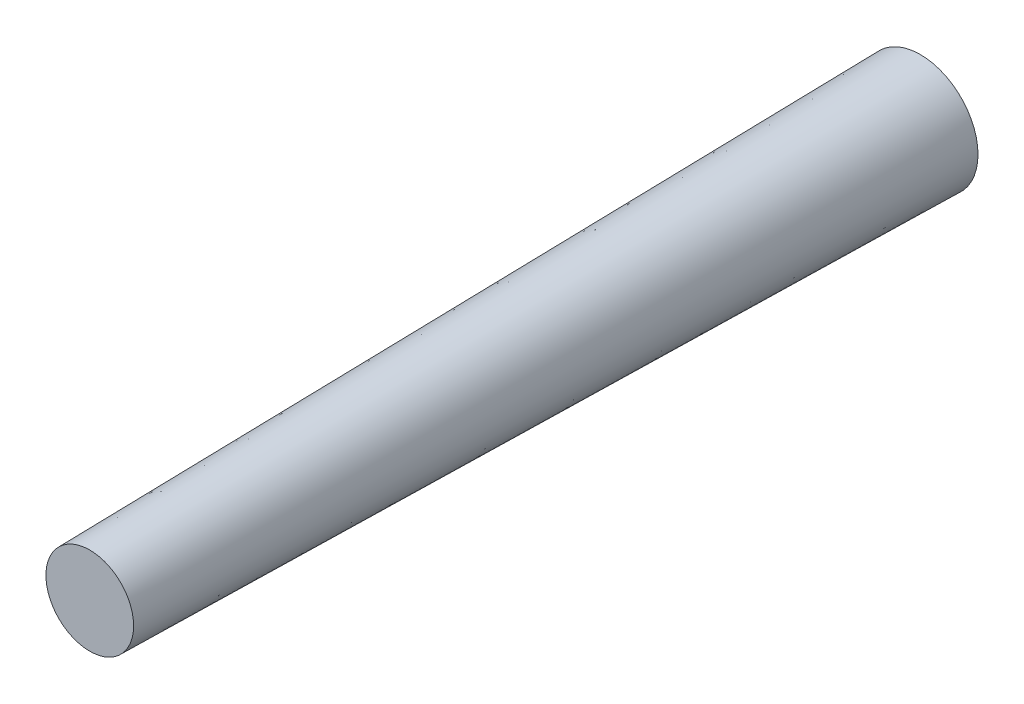
ISO-10303-21;
HEADER;
FILE_DESCRIPTION(('STEP AP214'),'2;1');
FILE_NAME('part.step','',(''),(''),'','','');
FILE_SCHEMA(('AUTOMOTIVE_DESIGN { 1 0 10303 214 1 1 1 1 }'));
ENDSEC;
DATA;
#1=APPLICATION_CONTEXT('core data for automotive mechanical design processes');
#2=APPLICATION_PROTOCOL_DEFINITION('international standard','automotive_design',2000,#1);
#3=PRODUCT_CONTEXT('',#1,'mechanical');
#4=PRODUCT('Part','Part','',(#3));
#5=PRODUCT_RELATED_PRODUCT_CATEGORY('part','',(#4));
#6=PRODUCT_DEFINITION_FORMATION('','',#4);
#7=PRODUCT_DEFINITION_CONTEXT('part definition',#1,'design');
#8=PRODUCT_DEFINITION('design','',#6,#7);
#9=PRODUCT_DEFINITION_SHAPE('','',#8);
#10=(LENGTH_UNIT() NAMED_UNIT(*) SI_UNIT(.MILLI.,.METRE.));
#11=(NAMED_UNIT(*) PLANE_ANGLE_UNIT() SI_UNIT($,.RADIAN.));
#12=(NAMED_UNIT(*) SI_UNIT($,.STERADIAN.) SOLID_ANGLE_UNIT());
#13=UNCERTAINTY_MEASURE_WITH_UNIT(LENGTH_MEASURE(1.E-05),#10,'distance_accuracy_value','');
#14=(GEOMETRIC_REPRESENTATION_CONTEXT(3) GLOBAL_UNCERTAINTY_ASSIGNED_CONTEXT((#13)) GLOBAL_UNIT_ASSIGNED_CONTEXT((#10,
#11,#12)) REPRESENTATION_CONTEXT('',''));
#15=CARTESIAN_POINT('',(0.,0.,0.));
#16=DIRECTION('',(0.,0.,1.));
#17=DIRECTION('',(1.,0.,0.));
#18=AXIS2_PLACEMENT_3D('',#15,#16,#17);
#19=CARTESIAN_POINT('',(0.,0.,0.));
#20=DIRECTION('',(0.,0.,-1.));
#21=DIRECTION('',(1.,0.,0.));
#22=AXIS2_PLACEMENT_3D('',#19,#20,#21);
#23=CONICAL_SURFACE('',#22,2.5,0.0166504410640259);
#24=CARTESIAN_POINT('',(0.,0.,36.));
#25=DIRECTION('',(0.,0.,1.));
#26=DIRECTION('',(1.,0.,0.));
#27=AXIS2_PLACEMENT_3D('',#24,#25,#26);
#28=CIRCLE('',#27,1.90052872209409);
#29=CARTESIAN_POINT('',(1.90052872209409,0.,36.));
#30=VERTEX_POINT('',#29);
#31=EDGE_CURVE('E10',#30,#30,#28,.T.);
#32=ORIENTED_EDGE('',*,*,#31,.F.);
#33=EDGE_LOOP('',(#32));
#34=FACE_BOUND('',#33,.T.);
#35=CARTESIAN_POINT('',(0.,0.,0.));
#36=DIRECTION('',(0.,0.,1.));
#37=DIRECTION('',(1.,0.,0.));
#38=AXIS2_PLACEMENT_3D('',#35,#36,#37);
#39=CIRCLE('',#38,2.5);
#40=CARTESIAN_POINT('',(2.5,0.,0.));
#41=VERTEX_POINT('',#40);
#42=EDGE_CURVE('E36',#41,#41,#39,.T.);
#43=ORIENTED_EDGE('',*,*,#42,.T.);
#44=EDGE_LOOP('',(#43));
#45=FACE_BOUND('',#44,.T.);
#46=ADVANCED_FACE('F30',(#34,#45),#23,.T.);
#47=CARTESIAN_POINT('',(0.,0.,36.));
#48=DIRECTION('',(0.,0.,1.));
#49=DIRECTION('',(1.,0.,0.));
#50=AXIS2_PLACEMENT_3D('',#47,#48,#49);
#51=PLANE('',#50);
#52=ORIENTED_EDGE('',*,*,#31,.T.);
#53=EDGE_LOOP('',(#52));
#54=FACE_BOUND('',#53,.T.);
#55=ADVANCED_FACE('F45',(#54),#51,.T.);
#56=CARTESIAN_POINT('',(0.,0.,0.));
#57=DIRECTION('',(0.,0.,1.));
#58=DIRECTION('',(1.,0.,0.));
#59=AXIS2_PLACEMENT_3D('',#56,#57,#58);
#60=PLANE('',#59);
#61=ORIENTED_EDGE('',*,*,#42,.F.);
#62=EDGE_LOOP('',(#61));
#63=FACE_BOUND('',#62,.T.);
#64=ADVANCED_FACE('F43',(#63),#60,.F.);
#65=CLOSED_SHELL('',(#46,#55,#64));
#66=MANIFOLD_SOLID_BREP('B2',#65);
#67=ADVANCED_BREP_SHAPE_REPRESENTATION('',(#18,#66),#14);
#68=SHAPE_DEFINITION_REPRESENTATION(#9,#67);
ENDSEC;
END-ISO-10303-21;
